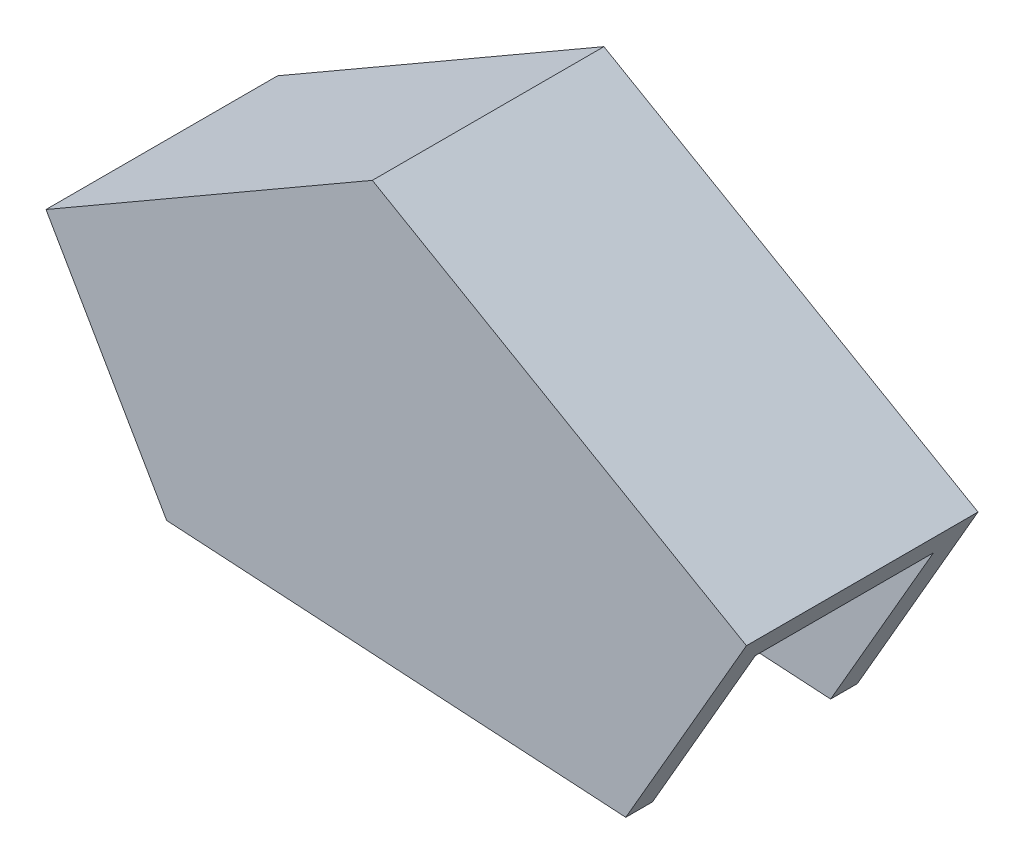
ISO-10303-21;
HEADER;
FILE_DESCRIPTION(('STEP AP214'),'2;1');
FILE_NAME('part.step','',(''),(''),'','','');
FILE_SCHEMA(('AUTOMOTIVE_DESIGN { 1 0 10303 214 1 1 1 1 }'));
ENDSEC;
DATA;
#1=APPLICATION_CONTEXT('core data for automotive mechanical design processes');
#2=APPLICATION_PROTOCOL_DEFINITION('international standard','automotive_design',2000,#1);
#3=PRODUCT_CONTEXT('',#1,'mechanical');
#4=PRODUCT('Part','Part','',(#3));
#5=PRODUCT_RELATED_PRODUCT_CATEGORY('part','',(#4));
#6=PRODUCT_DEFINITION_FORMATION('','',#4);
#7=PRODUCT_DEFINITION_CONTEXT('part definition',#1,'design');
#8=PRODUCT_DEFINITION('design','',#6,#7);
#9=PRODUCT_DEFINITION_SHAPE('','',#8);
#10=(LENGTH_UNIT() NAMED_UNIT(*) SI_UNIT(.MILLI.,.METRE.));
#11=(NAMED_UNIT(*) PLANE_ANGLE_UNIT() SI_UNIT($,.RADIAN.));
#12=(NAMED_UNIT(*) SI_UNIT($,.STERADIAN.) SOLID_ANGLE_UNIT());
#13=UNCERTAINTY_MEASURE_WITH_UNIT(LENGTH_MEASURE(1.E-05),#10,'distance_accuracy_value','');
#14=(GEOMETRIC_REPRESENTATION_CONTEXT(3) GLOBAL_UNCERTAINTY_ASSIGNED_CONTEXT((#13)) GLOBAL_UNIT_ASSIGNED_CONTEXT((#10,
#11,#12)) REPRESENTATION_CONTEXT('',''));
#15=CARTESIAN_POINT('',(0.,0.,0.));
#16=DIRECTION('',(0.,0.,1.));
#17=DIRECTION('',(1.,0.,0.));
#18=AXIS2_PLACEMENT_3D('',#15,#16,#17);
#19=CARTESIAN_POINT('',(0.,0.,10.));
#20=DIRECTION('',(-0.499999999999995,0.866025403784442,0.));
#21=DIRECTION('',(-0.866025403784442,-0.499999999999995,0.));
#22=AXIS2_PLACEMENT_3D('',#19,#20,#21);
#23=PLANE('',#22);
#24=DIRECTION('',(0.866025403784442,0.499999999999995,0.));
#25=VECTOR('',#24,1.);
#26=CARTESIAN_POINT('',(0.,0.,0.));
#27=LINE('',#26,#25);
#28=CARTESIAN_POINT('',(-17.3205080756888,-9.9999999999999,0.));
#29=VERTEX_POINT('',#28);
#30=CARTESIAN_POINT('',(0.,0.,0.));
#31=VERTEX_POINT('',#30);
#32=EDGE_CURVE('E173',#29,#31,#27,.T.);
#33=ORIENTED_EDGE('',*,*,#32,.T.);
#34=DIRECTION('',(0.,0.,-1.));
#35=VECTOR('',#34,1.);
#36=CARTESIAN_POINT('',(0.,0.,10.));
#37=LINE('',#36,#35);
#38=CARTESIAN_POINT('',(0.,0.,10.));
#39=VERTEX_POINT('',#38);
#40=EDGE_CURVE('E11',#39,#31,#37,.T.);
#41=ORIENTED_EDGE('',*,*,#40,.F.);
#42=DIRECTION('',(0.866025403784442,0.499999999999995,0.));
#43=VECTOR('',#42,1.);
#44=CARTESIAN_POINT('',(0.,0.,10.));
#45=LINE('',#44,#43);
#46=CARTESIAN_POINT('',(-17.3205080756888,-9.9999999999999,10.));
#47=VERTEX_POINT('',#46);
#48=EDGE_CURVE('E174',#47,#39,#45,.T.);
#49=ORIENTED_EDGE('',*,*,#48,.F.);
#50=DIRECTION('',(0.,0.,-1.));
#51=VECTOR('',#50,1.);
#52=CARTESIAN_POINT('',(-17.3205080756888,-9.9999999999999,10.));
#53=LINE('',#52,#51);
#54=EDGE_CURVE('E48',#47,#29,#53,.T.);
#55=ORIENTED_EDGE('',*,*,#54,.T.);
#56=EDGE_LOOP('',(#33,#41,#49,#55));
#57=FACE_BOUND('',#56,.T.);
#58=ADVANCED_FACE('F33',(#57),#23,.F.);
#59=CARTESIAN_POINT('',(0.,0.,10.));
#60=DIRECTION('',(0.500000000000001,0.866025403784438,0.));
#61=DIRECTION('',(-0.866025403784438,0.500000000000001,0.));
#62=AXIS2_PLACEMENT_3D('',#59,#60,#61);
#63=PLANE('',#62);
#64=DIRECTION('',(0.866025403784438,-0.500000000000001,0.));
#65=VECTOR('',#64,1.);
#66=CARTESIAN_POINT('',(0.,0.,0.));
#67=LINE('',#66,#65);
#68=CARTESIAN_POINT('',(20.,-11.5470053837925,0.));
#69=VERTEX_POINT('',#68);
#70=EDGE_CURVE('E178',#31,#69,#67,.T.);
#71=ORIENTED_EDGE('',*,*,#70,.T.);
#72=DIRECTION('',(0.,0.,-1.));
#73=VECTOR('',#72,1.);
#74=CARTESIAN_POINT('',(20.,-11.5470053837925,10.));
#75=LINE('',#74,#73);
#76=CARTESIAN_POINT('',(20.,-11.5470053837925,10.));
#77=VERTEX_POINT('',#76);
#78=EDGE_CURVE('E41',#77,#69,#75,.T.);
#79=ORIENTED_EDGE('',*,*,#78,.F.);
#80=DIRECTION('',(0.866025403784438,-0.500000000000001,0.));
#81=VECTOR('',#80,1.);
#82=CARTESIAN_POINT('',(0.,0.,10.));
#83=LINE('',#82,#81);
#84=EDGE_CURVE('E177',#39,#77,#83,.T.);
#85=ORIENTED_EDGE('',*,*,#84,.F.);
#86=ORIENTED_EDGE('',*,*,#40,.T.);
#87=EDGE_LOOP('',(#71,#79,#85,#86));
#88=FACE_BOUND('',#87,.T.);
#89=ADVANCED_FACE('F194',(#88),#63,.F.);
#90=CARTESIAN_POINT('',(21.,-9.81495457622367,10.));
#91=DIRECTION('',(-0.866025403784438,0.500000000000001,0.));
#92=DIRECTION('',(-0.500000000000001,-0.866025403784438,0.));
#93=AXIS2_PLACEMENT_3D('',#90,#91,#92);
#94=PLANE('',#93);
#95=ORIENTED_EDGE('',*,*,#78,.T.);
#96=DIRECTION('',(0.499999999999999,0.866025403784439,0.));
#97=VECTOR('',#96,1.);
#98=CARTESIAN_POINT('',(20.,-11.5470053837925,0.));
#99=LINE('',#98,#97);
#100=CARTESIAN_POINT('',(14.2264973081038,-21.5470053837925,0.));
#101=VERTEX_POINT('',#100);
#102=EDGE_CURVE('E138',#101,#69,#99,.T.);
#103=ORIENTED_EDGE('',*,*,#102,.F.);
#104=DIRECTION('',(0.,0.,1.));
#105=VECTOR('',#104,1.);
#106=CARTESIAN_POINT('',(14.2264973081038,-21.5470053837925,-1.5));
#107=LINE('',#106,#105);
#108=CARTESIAN_POINT('',(14.2264973081038,-21.5470053837925,-1.5));
#109=VERTEX_POINT('',#108);
#110=EDGE_CURVE('E146',#109,#101,#107,.T.);
#111=ORIENTED_EDGE('',*,*,#110,.F.);
#112=DIRECTION('',(0.499999999999999,0.866025403784439,0.));
#113=VECTOR('',#112,1.);
#114=CARTESIAN_POINT('',(21.,-9.81495457622367,-1.5));
#115=LINE('',#114,#113);
#116=CARTESIAN_POINT('',(21.,-9.81495457622367,-1.5));
#117=VERTEX_POINT('',#116);
#118=EDGE_CURVE('E131',#109,#117,#115,.T.);
#119=ORIENTED_EDGE('',*,*,#118,.T.);
#120=DIRECTION('',(0.,0.,-1.));
#121=VECTOR('',#120,1.);
#122=CARTESIAN_POINT('',(21.,-9.81495457622367,10.));
#123=LINE('',#122,#121);
#124=CARTESIAN_POINT('',(21.,-9.81495457622367,11.5));
#125=VERTEX_POINT('',#124);
#126=EDGE_CURVE('E187',#125,#117,#123,.T.);
#127=ORIENTED_EDGE('',*,*,#126,.F.);
#128=DIRECTION('',(0.499999999999999,0.866025403784439,0.));
#129=VECTOR('',#128,1.);
#130=CARTESIAN_POINT('',(20.,-11.5470053837925,11.5));
#131=LINE('',#130,#129);
#132=CARTESIAN_POINT('',(14.2264973081038,-21.5470053837925,11.5));
#133=VERTEX_POINT('',#132);
#134=EDGE_CURVE('E153',#133,#125,#131,.T.);
#135=ORIENTED_EDGE('',*,*,#134,.F.);
#136=DIRECTION('',(0.,0.,-1.));
#137=VECTOR('',#136,1.);
#138=CARTESIAN_POINT('',(14.2264973081038,-21.5470053837925,11.5));
#139=LINE('',#138,#137);
#140=CARTESIAN_POINT('',(14.2264973081038,-21.5470053837925,10.));
#141=VERTEX_POINT('',#140);
#142=EDGE_CURVE('E161',#133,#141,#139,.T.);
#143=ORIENTED_EDGE('',*,*,#142,.T.);
#144=DIRECTION('',(0.499999999999999,0.866025403784439,0.));
#145=VECTOR('',#144,1.);
#146=CARTESIAN_POINT('',(21.,-9.81495457622367,10.));
#147=LINE('',#146,#145);
#148=EDGE_CURVE('E151',#141,#77,#147,.T.);
#149=ORIENTED_EDGE('',*,*,#148,.T.);
#150=EDGE_LOOP('',(#95,#103,#111,#119,#127,#135,#143,#149));
#151=FACE_BOUND('',#150,.T.);
#152=ADVANCED_FACE('F191',(#151),#94,.F.);
#153=CARTESIAN_POINT('',(0.,2.3094010767585,10.));
#154=DIRECTION('',(-0.500000000000001,-0.866025403784438,0.));
#155=DIRECTION('',(0.866025403784438,-0.500000000000001,0.));
#156=AXIS2_PLACEMENT_3D('',#153,#154,#155);
#157=PLANE('',#156);
#158=ORIENTED_EDGE('',*,*,#126,.T.);
#159=DIRECTION('',(-0.866025403784438,0.500000000000001,0.));
#160=VECTOR('',#159,1.);
#161=CARTESIAN_POINT('',(0.,2.3094010767585,-1.5));
#162=LINE('',#161,#160);
#163=CARTESIAN_POINT('',(0.,2.3094010767585,-1.5));
#164=VERTEX_POINT('',#163);
#165=EDGE_CURVE('E129',#117,#164,#162,.T.);
#166=ORIENTED_EDGE('',*,*,#165,.T.);
#167=DIRECTION('',(0.,0.,-1.));
#168=VECTOR('',#167,1.);
#169=CARTESIAN_POINT('',(0.,2.3094010767585,10.));
#170=LINE('',#169,#168);
#171=CARTESIAN_POINT('',(0.,2.3094010767585,11.5));
#172=VERTEX_POINT('',#171);
#173=EDGE_CURVE('E115',#172,#164,#170,.T.);
#174=ORIENTED_EDGE('',*,*,#173,.F.);
#175=DIRECTION('',(-0.866025403784438,0.500000000000001,0.));
#176=VECTOR('',#175,1.);
#177=CARTESIAN_POINT('',(0.,2.3094010767585,11.5));
#178=LINE('',#177,#176);
#179=EDGE_CURVE('E156',#125,#172,#178,.T.);
#180=ORIENTED_EDGE('',*,*,#179,.F.);
#181=EDGE_LOOP('',(#158,#166,#174,#180));
#182=FACE_BOUND('',#181,.T.);
#183=ADVANCED_FACE('F208',(#182),#157,.F.);
#184=CARTESIAN_POINT('',(0.,2.3094010767585,10.));
#185=DIRECTION('',(0.499999999999995,-0.866025403784442,0.));
#186=DIRECTION('',(0.866025403784442,0.499999999999995,0.));
#187=AXIS2_PLACEMENT_3D('',#184,#185,#186);
#188=PLANE('',#187);
#189=ORIENTED_EDGE('',*,*,#173,.T.);
#190=DIRECTION('',(-0.866025403784442,-0.499999999999995,0.));
#191=VECTOR('',#190,1.);
#192=CARTESIAN_POINT('',(-18.3205080756888,-8.26794919243102,-1.5));
#193=LINE('',#192,#191);
#194=CARTESIAN_POINT('',(-18.3205080756888,-8.26794919243102,-1.5));
#195=VERTEX_POINT('',#194);
#196=EDGE_CURVE('E122',#164,#195,#193,.T.);
#197=ORIENTED_EDGE('',*,*,#196,.T.);
#198=DIRECTION('',(0.,0.,-1.));
#199=VECTOR('',#198,1.);
#200=CARTESIAN_POINT('',(-18.3205080756888,-8.26794919243102,10.));
#201=LINE('',#200,#199);
#202=CARTESIAN_POINT('',(-18.3205080756888,-8.26794919243102,11.5));
#203=VERTEX_POINT('',#202);
#204=EDGE_CURVE('E103',#203,#195,#201,.T.);
#205=ORIENTED_EDGE('',*,*,#204,.F.);
#206=DIRECTION('',(-0.866025403784442,-0.499999999999995,0.));
#207=VECTOR('',#206,1.);
#208=CARTESIAN_POINT('',(-18.3205080756888,-8.26794919243102,11.5));
#209=LINE('',#208,#207);
#210=EDGE_CURVE('E159',#172,#203,#209,.T.);
#211=ORIENTED_EDGE('',*,*,#210,.F.);
#212=EDGE_LOOP('',(#189,#197,#205,#211));
#213=FACE_BOUND('',#212,.T.);
#214=ADVANCED_FACE('F128',(#213),#188,.F.);
#215=CARTESIAN_POINT('',(-18.3205080756888,-8.26794919243102,10.));
#216=DIRECTION('',(0.86602540378444,0.499999999999997,0.));
#217=DIRECTION('',(-0.499999999999997,0.86602540378444,0.));
#218=AXIS2_PLACEMENT_3D('',#215,#216,#217);
#219=PLANE('',#218);
#220=ORIENTED_EDGE('',*,*,#204,.T.);
#221=DIRECTION('',(0.499999999999997,-0.86602540378444,0.));
#222=VECTOR('',#221,1.);
#223=CARTESIAN_POINT('',(-18.3205080756888,-8.26794919243102,-1.5));
#224=LINE('',#223,#222);
#225=CARTESIAN_POINT('',(-11.5470053837926,-19.9999999999999,-1.5));
#226=VERTEX_POINT('',#225);
#227=EDGE_CURVE('E107',#195,#226,#224,.T.);
#228=ORIENTED_EDGE('',*,*,#227,.T.);
#229=DIRECTION('',(0.,0.,1.));
#230=VECTOR('',#229,1.);
#231=CARTESIAN_POINT('',(-11.5470053837926,-19.9999999999999,-1.5));
#232=LINE('',#231,#230);
#233=CARTESIAN_POINT('',(-11.5470053837926,-19.9999999999999,0.));
#234=VERTEX_POINT('',#233);
#235=EDGE_CURVE('E137',#226,#234,#232,.T.);
#236=ORIENTED_EDGE('',*,*,#235,.T.);
#237=DIRECTION('',(0.499999999999997,-0.86602540378444,0.));
#238=VECTOR('',#237,1.);
#239=CARTESIAN_POINT('',(-17.3205080756888,-9.9999999999999,0.));
#240=LINE('',#239,#238);
#241=EDGE_CURVE('E126',#29,#234,#240,.T.);
#242=ORIENTED_EDGE('',*,*,#241,.F.);
#243=ORIENTED_EDGE('',*,*,#54,.F.);
#244=DIRECTION('',(0.499999999999997,-0.86602540378444,0.));
#245=VECTOR('',#244,1.);
#246=CARTESIAN_POINT('',(-17.3205080756888,-9.9999999999999,10.));
#247=LINE('',#246,#245);
#248=CARTESIAN_POINT('',(-11.5470053837926,-19.9999999999999,10.));
#249=VERTEX_POINT('',#248);
#250=EDGE_CURVE('E148',#47,#249,#247,.T.);
#251=ORIENTED_EDGE('',*,*,#250,.T.);
#252=DIRECTION('',(0.,0.,-1.));
#253=VECTOR('',#252,1.);
#254=CARTESIAN_POINT('',(-11.5470053837926,-19.9999999999999,11.5));
#255=LINE('',#254,#253);
#256=CARTESIAN_POINT('',(-11.5470053837926,-19.9999999999999,11.5));
#257=VERTEX_POINT('',#256);
#258=EDGE_CURVE('E170',#257,#249,#255,.T.);
#259=ORIENTED_EDGE('',*,*,#258,.F.);
#260=DIRECTION('',(0.499999999999997,-0.86602540378444,0.));
#261=VECTOR('',#260,1.);
#262=CARTESIAN_POINT('',(-18.3205080756888,-8.26794919243102,11.5));
#263=LINE('',#262,#261);
#264=EDGE_CURVE('E110',#203,#257,#263,.T.);
#265=ORIENTED_EDGE('',*,*,#264,.F.);
#266=EDGE_LOOP('',(#220,#228,#236,#242,#243,#251,#259,#265));
#267=FACE_BOUND('',#266,.T.);
#268=ADVANCED_FACE('F105',(#267),#219,.F.);
#269=CARTESIAN_POINT('',(0.,0.,10.));
#270=DIRECTION('',(0.,0.,1.));
#271=DIRECTION('',(1.,0.,0.));
#272=AXIS2_PLACEMENT_3D('',#269,#270,#271);
#273=PLANE('',#272);
#274=ORIENTED_EDGE('',*,*,#250,.F.);
#275=ORIENTED_EDGE('',*,*,#48,.T.);
#276=ORIENTED_EDGE('',*,*,#84,.T.);
#277=ORIENTED_EDGE('',*,*,#148,.F.);
#278=DIRECTION('',(0.998203466991462,-0.0599152608792211,0.));
#279=VECTOR('',#278,1.);
#280=CARTESIAN_POINT('',(-11.5470053837926,-19.9999999999999,10.));
#281=LINE('',#280,#279);
#282=EDGE_CURVE('E163',#249,#141,#281,.T.);
#283=ORIENTED_EDGE('',*,*,#282,.F.);
#284=EDGE_LOOP('',(#274,#275,#276,#277,#283));
#285=FACE_BOUND('',#284,.T.);
#286=ADVANCED_FACE('F198',(#285),#273,.F.);
#287=CARTESIAN_POINT('',(-11.5470053837926,-19.9999999999999,11.5));
#288=DIRECTION('',(0.0599152608792211,0.998203466991462,0.));
#289=DIRECTION('',(-0.998203466991462,0.0599152608792211,0.));
#290=AXIS2_PLACEMENT_3D('',#287,#288,#289);
#291=PLANE('',#290);
#292=ORIENTED_EDGE('',*,*,#282,.T.);
#293=ORIENTED_EDGE('',*,*,#142,.F.);
#294=DIRECTION('',(0.998203466991462,-0.0599152608792211,0.));
#295=VECTOR('',#294,1.);
#296=CARTESIAN_POINT('',(-11.5470053837926,-19.9999999999999,11.5));
#297=LINE('',#296,#295);
#298=EDGE_CURVE('E150',#257,#133,#297,.T.);
#299=ORIENTED_EDGE('',*,*,#298,.F.);
#300=ORIENTED_EDGE('',*,*,#258,.T.);
#301=EDGE_LOOP('',(#292,#293,#299,#300));
#302=FACE_BOUND('',#301,.T.);
#303=ADVANCED_FACE('F215',(#302),#291,.F.);
#304=CARTESIAN_POINT('',(0.,0.,11.5));
#305=DIRECTION('',(0.,0.,1.));
#306=DIRECTION('',(1.,0.,0.));
#307=AXIS2_PLACEMENT_3D('',#304,#305,#306);
#308=PLANE('',#307);
#309=ORIENTED_EDGE('',*,*,#264,.T.);
#310=ORIENTED_EDGE('',*,*,#298,.T.);
#311=ORIENTED_EDGE('',*,*,#134,.T.);
#312=ORIENTED_EDGE('',*,*,#179,.T.);
#313=ORIENTED_EDGE('',*,*,#210,.T.);
#314=EDGE_LOOP('',(#309,#310,#311,#312,#313));
#315=FACE_BOUND('',#314,.T.);
#316=ADVANCED_FACE('F211',(#315),#308,.T.);
#317=CARTESIAN_POINT('',(-11.5470053837926,-19.9999999999999,-1.5));
#318=DIRECTION('',(-0.0599152608792211,-0.998203466991462,0.));
#319=DIRECTION('',(0.998203466991462,-0.0599152608792211,0.));
#320=AXIS2_PLACEMENT_3D('',#317,#318,#319);
#321=PLANE('',#320);
#322=DIRECTION('',(0.998203466991462,-0.0599152608792211,0.));
#323=VECTOR('',#322,1.);
#324=CARTESIAN_POINT('',(-11.5470053837926,-19.9999999999999,0.));
#325=LINE('',#324,#323);
#326=EDGE_CURVE('E141',#234,#101,#325,.T.);
#327=ORIENTED_EDGE('',*,*,#326,.F.);
#328=ORIENTED_EDGE('',*,*,#235,.F.);
#329=DIRECTION('',(0.998203466991462,-0.0599152608792211,0.));
#330=VECTOR('',#329,1.);
#331=CARTESIAN_POINT('',(-11.5470053837926,-19.9999999999999,-1.5));
#332=LINE('',#331,#330);
#333=EDGE_CURVE('E125',#226,#109,#332,.T.);
#334=ORIENTED_EDGE('',*,*,#333,.T.);
#335=ORIENTED_EDGE('',*,*,#110,.T.);
#336=EDGE_LOOP('',(#327,#328,#334,#335));
#337=FACE_BOUND('',#336,.T.);
#338=ADVANCED_FACE('F205',(#337),#321,.T.);
#339=CARTESIAN_POINT('',(0.,0.,-1.5));
#340=DIRECTION('',(0.,0.,-1.));
#341=DIRECTION('',(1.,0.,0.));
#342=AXIS2_PLACEMENT_3D('',#339,#340,#341);
#343=PLANE('',#342);
#344=ORIENTED_EDGE('',*,*,#227,.F.);
#345=ORIENTED_EDGE('',*,*,#196,.F.);
#346=ORIENTED_EDGE('',*,*,#165,.F.);
#347=ORIENTED_EDGE('',*,*,#118,.F.);
#348=ORIENTED_EDGE('',*,*,#333,.F.);
#349=EDGE_LOOP('',(#344,#345,#346,#347,#348));
#350=FACE_BOUND('',#349,.T.);
#351=ADVANCED_FACE('F120',(#350),#343,.T.);
#352=CARTESIAN_POINT('',(0.,0.,0.));
#353=DIRECTION('',(0.,0.,-1.));
#354=DIRECTION('',(1.,0.,0.));
#355=AXIS2_PLACEMENT_3D('',#352,#353,#354);
#356=PLANE('',#355);
#357=ORIENTED_EDGE('',*,*,#32,.F.);
#358=ORIENTED_EDGE('',*,*,#241,.T.);
#359=ORIENTED_EDGE('',*,*,#326,.T.);
#360=ORIENTED_EDGE('',*,*,#102,.T.);
#361=ORIENTED_EDGE('',*,*,#70,.F.);
#362=EDGE_LOOP('',(#357,#358,#359,#360,#361));
#363=FACE_BOUND('',#362,.T.);
#364=ADVANCED_FACE('F202',(#363),#356,.F.);
#365=CLOSED_SHELL('',(#58,#89,#152,#183,#214,#268,#286,#303,#316,#338,#351,#364));
#366=MANIFOLD_SOLID_BREP('B2',#365);
#367=ADVANCED_BREP_SHAPE_REPRESENTATION('',(#18,#366),#14);
#368=SHAPE_DEFINITION_REPRESENTATION(#9,#367);
ENDSEC;
END-ISO-10303-21;
